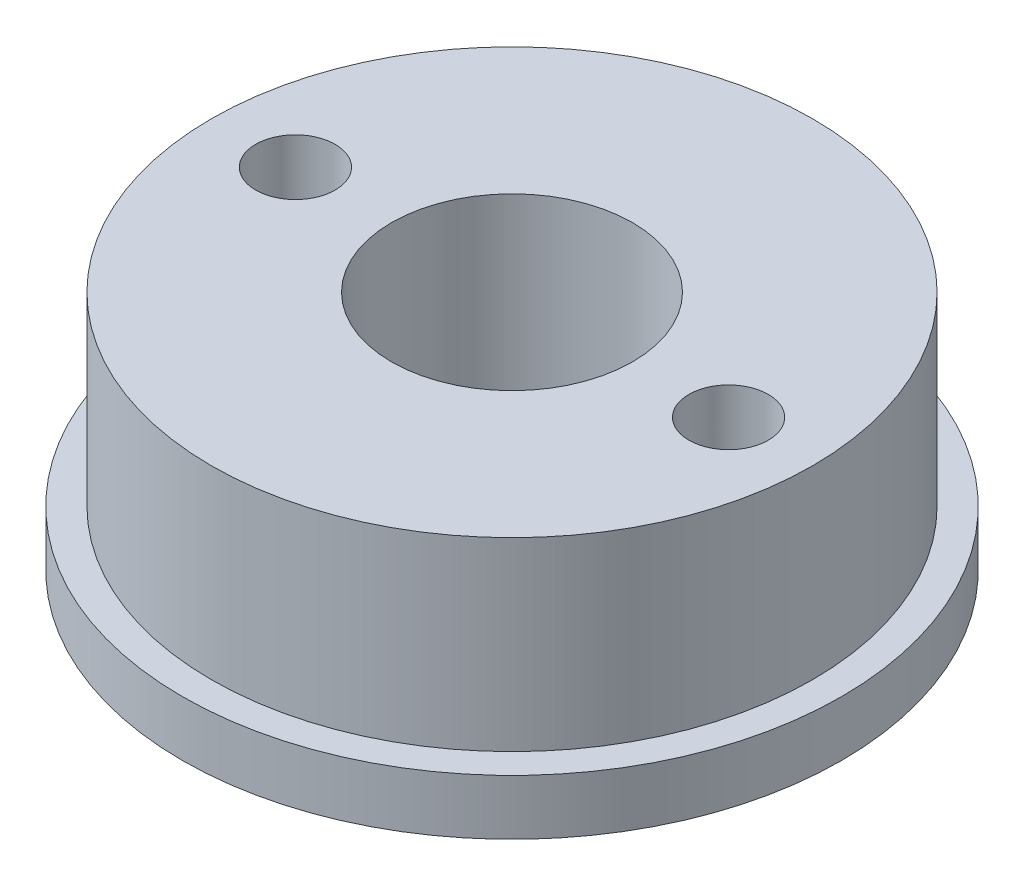
ISO-10303-21;
HEADER;
FILE_DESCRIPTION(('STEP AP214'),'2;1');
FILE_NAME('part.step','',(''),(''),'','','');
FILE_SCHEMA(('AUTOMOTIVE_DESIGN { 1 0 10303 214 1 1 1 1 }'));
ENDSEC;
DATA;
#1=APPLICATION_CONTEXT('core data for automotive mechanical design processes');
#2=APPLICATION_PROTOCOL_DEFINITION('international standard','automotive_design',2000,#1);
#3=PRODUCT_CONTEXT('',#1,'mechanical');
#4=PRODUCT('Part','Part','',(#3));
#5=PRODUCT_RELATED_PRODUCT_CATEGORY('part','',(#4));
#6=PRODUCT_DEFINITION_FORMATION('','',#4);
#7=PRODUCT_DEFINITION_CONTEXT('part definition',#1,'design');
#8=PRODUCT_DEFINITION('design','',#6,#7);
#9=PRODUCT_DEFINITION_SHAPE('','',#8);
#10=(LENGTH_UNIT() NAMED_UNIT(*) SI_UNIT(.MILLI.,.METRE.));
#11=(NAMED_UNIT(*) PLANE_ANGLE_UNIT() SI_UNIT($,.RADIAN.));
#12=(NAMED_UNIT(*) SI_UNIT($,.STERADIAN.) SOLID_ANGLE_UNIT());
#13=UNCERTAINTY_MEASURE_WITH_UNIT(LENGTH_MEASURE(1.E-05),#10,'distance_accuracy_value','');
#14=(GEOMETRIC_REPRESENTATION_CONTEXT(3) GLOBAL_UNCERTAINTY_ASSIGNED_CONTEXT((#13)) GLOBAL_UNIT_ASSIGNED_CONTEXT((#10,
#11,#12)) REPRESENTATION_CONTEXT('',''));
#15=CARTESIAN_POINT('',(0.,0.,0.));
#16=DIRECTION('',(0.,0.,1.));
#17=DIRECTION('',(1.,0.,0.));
#18=AXIS2_PLACEMENT_3D('',#15,#16,#17);
#19=CARTESIAN_POINT('',(0.,2.3,0.));
#20=DIRECTION('',(0.,-1.,0.));
#21=DIRECTION('',(0.,0.,-1.));
#22=AXIS2_PLACEMENT_3D('',#19,#20,#21);
#23=CYLINDRICAL_SURFACE('',#22,13.7);
#24=CARTESIAN_POINT('',(0.,2.3,0.));
#25=DIRECTION('',(0.,1.,0.));
#26=DIRECTION('',(0.,0.,1.));
#27=AXIS2_PLACEMENT_3D('',#24,#25,#26);
#28=CIRCLE('',#27,13.7);
#29=CARTESIAN_POINT('',(0.,2.3,13.7));
#30=VERTEX_POINT('',#29);
#31=EDGE_CURVE('E41',#30,#30,#28,.T.);
#32=ORIENTED_EDGE('',*,*,#31,.F.);
#33=EDGE_LOOP('',(#32));
#34=FACE_BOUND('',#33,.T.);
#35=CARTESIAN_POINT('',(0.,0.,0.));
#36=DIRECTION('',(0.,1.,0.));
#37=DIRECTION('',(0.,0.,1.));
#38=AXIS2_PLACEMENT_3D('',#35,#36,#37);
#39=CIRCLE('',#38,13.7);
#40=CARTESIAN_POINT('',(0.,0.,13.7));
#41=VERTEX_POINT('',#40);
#42=EDGE_CURVE('E37',#41,#41,#39,.T.);
#43=ORIENTED_EDGE('',*,*,#42,.T.);
#44=EDGE_LOOP('',(#43));
#45=FACE_BOUND('',#44,.T.);
#46=ADVANCED_FACE('F34',(#34,#45),#23,.T.);
#47=CARTESIAN_POINT('',(0.,2.3,0.));
#48=DIRECTION('',(0.,1.,0.));
#49=DIRECTION('',(0.,0.,1.));
#50=AXIS2_PLACEMENT_3D('',#47,#48,#49);
#51=PLANE('',#50);
#52=CARTESIAN_POINT('',(0.,2.3,0.));
#53=DIRECTION('',(0.,1.,0.));
#54=DIRECTION('',(0.,0.,1.));
#55=AXIS2_PLACEMENT_3D('',#52,#53,#54);
#56=CIRCLE('',#55,12.49);
#57=CARTESIAN_POINT('',(0.,2.3,12.49));
#58=VERTEX_POINT('',#57);
#59=EDGE_CURVE('E10',#58,#58,#56,.T.);
#60=ORIENTED_EDGE('',*,*,#59,.F.);
#61=EDGE_LOOP('',(#60));
#62=FACE_BOUND('',#61,.T.);
#63=ORIENTED_EDGE('',*,*,#31,.T.);
#64=EDGE_LOOP('',(#63));
#65=FACE_BOUND('',#64,.T.);
#66=ADVANCED_FACE('F76',(#62,#65),#51,.T.);
#67=CARTESIAN_POINT('',(0.,0.,0.));
#68=DIRECTION('',(0.,1.,0.));
#69=DIRECTION('',(0.,0.,1.));
#70=AXIS2_PLACEMENT_3D('',#67,#68,#69);
#71=PLANE('',#70);
#72=CARTESIAN_POINT('',(-9.,0.,0.));
#73=DIRECTION('',(0.,-1.,0.));
#74=DIRECTION('',(0.,0.,1.));
#75=AXIS2_PLACEMENT_3D('',#72,#73,#74);
#76=CIRCLE('',#75,1.65);
#77=CARTESIAN_POINT('',(-9.,0.,1.65));
#78=VERTEX_POINT('',#77);
#79=EDGE_CURVE('E61',#78,#78,#76,.T.);
#80=ORIENTED_EDGE('',*,*,#79,.F.);
#81=EDGE_LOOP('',(#80));
#82=FACE_BOUND('',#81,.T.);
#83=CARTESIAN_POINT('',(9.,0.,0.));
#84=DIRECTION('',(0.,-1.,0.));
#85=DIRECTION('',(0.,0.,-1.));
#86=AXIS2_PLACEMENT_3D('',#83,#84,#85);
#87=CIRCLE('',#86,1.65);
#88=CARTESIAN_POINT('',(9.,0.,-1.65));
#89=VERTEX_POINT('',#88);
#90=EDGE_CURVE('E60',#89,#89,#87,.T.);
#91=ORIENTED_EDGE('',*,*,#90,.F.);
#92=EDGE_LOOP('',(#91));
#93=FACE_BOUND('',#92,.T.);
#94=CARTESIAN_POINT('',(0.,0.,0.));
#95=DIRECTION('',(0.,-1.,0.));
#96=DIRECTION('',(0.,0.,-1.));
#97=AXIS2_PLACEMENT_3D('',#94,#95,#96);
#98=CIRCLE('',#97,5.01);
#99=CARTESIAN_POINT('',(0.,0.,-5.01));
#100=VERTEX_POINT('',#99);
#101=EDGE_CURVE('E53',#100,#100,#98,.T.);
#102=ORIENTED_EDGE('',*,*,#101,.F.);
#103=EDGE_LOOP('',(#102));
#104=FACE_BOUND('',#103,.T.);
#105=ORIENTED_EDGE('',*,*,#42,.F.);
#106=EDGE_LOOP('',(#105));
#107=FACE_BOUND('',#106,.T.);
#108=ADVANCED_FACE('F72',(#82,#93,#104,#107),#71,.F.);
#109=CARTESIAN_POINT('',(0.,10.,0.));
#110=DIRECTION('',(0.,-1.,0.));
#111=DIRECTION('',(0.,0.,-1.));
#112=AXIS2_PLACEMENT_3D('',#109,#110,#111);
#113=CYLINDRICAL_SURFACE('',#112,12.49);
#114=CARTESIAN_POINT('',(0.,10.,0.));
#115=DIRECTION('',(0.,1.,0.));
#116=DIRECTION('',(0.,0.,1.));
#117=AXIS2_PLACEMENT_3D('',#114,#115,#116);
#118=CIRCLE('',#117,12.49);
#119=CARTESIAN_POINT('',(0.,10.,12.49));
#120=VERTEX_POINT('',#119);
#121=EDGE_CURVE('E47',#120,#120,#118,.T.);
#122=ORIENTED_EDGE('',*,*,#121,.F.);
#123=EDGE_LOOP('',(#122));
#124=FACE_BOUND('',#123,.T.);
#125=ORIENTED_EDGE('',*,*,#59,.T.);
#126=EDGE_LOOP('',(#125));
#127=FACE_BOUND('',#126,.T.);
#128=ADVANCED_FACE('F75',(#124,#127),#113,.T.);
#129=CARTESIAN_POINT('',(0.,10.,0.));
#130=DIRECTION('',(0.,1.,0.));
#131=DIRECTION('',(0.,0.,1.));
#132=AXIS2_PLACEMENT_3D('',#129,#130,#131);
#133=PLANE('',#132);
#134=CARTESIAN_POINT('',(-9.,10.,0.));
#135=DIRECTION('',(0.,1.,0.));
#136=DIRECTION('',(0.,0.,1.));
#137=AXIS2_PLACEMENT_3D('',#134,#135,#136);
#138=CIRCLE('',#137,1.65);
#139=CARTESIAN_POINT('',(-9.,10.,1.65));
#140=VERTEX_POINT('',#139);
#141=EDGE_CURVE('E57',#140,#140,#138,.F.);
#142=ORIENTED_EDGE('',*,*,#141,.T.);
#143=EDGE_LOOP('',(#142));
#144=FACE_BOUND('',#143,.T.);
#145=CARTESIAN_POINT('',(9.,10.,0.));
#146=DIRECTION('',(0.,1.,0.));
#147=DIRECTION('',(0.,0.,1.));
#148=AXIS2_PLACEMENT_3D('',#145,#146,#147);
#149=CIRCLE('',#148,1.65);
#150=CARTESIAN_POINT('',(9.,10.,1.65));
#151=VERTEX_POINT('',#150);
#152=EDGE_CURVE('E56',#151,#151,#149,.F.);
#153=ORIENTED_EDGE('',*,*,#152,.T.);
#154=EDGE_LOOP('',(#153));
#155=FACE_BOUND('',#154,.T.);
#156=CARTESIAN_POINT('',(0.,10.,0.));
#157=DIRECTION('',(0.,1.,0.));
#158=DIRECTION('',(0.,0.,1.));
#159=AXIS2_PLACEMENT_3D('',#156,#157,#158);
#160=CIRCLE('',#159,5.01);
#161=CARTESIAN_POINT('',(0.,10.,5.01));
#162=VERTEX_POINT('',#161);
#163=EDGE_CURVE('E50',#162,#162,#160,.F.);
#164=ORIENTED_EDGE('',*,*,#163,.T.);
#165=EDGE_LOOP('',(#164));
#166=FACE_BOUND('',#165,.T.);
#167=ORIENTED_EDGE('',*,*,#121,.T.);
#168=EDGE_LOOP('',(#167));
#169=FACE_BOUND('',#168,.T.);
#170=ADVANCED_FACE('F97',(#144,#155,#166,#169),#133,.T.);
#171=CARTESIAN_POINT('',(0.,24.1704198949784,0.));
#172=DIRECTION('',(0.,-1.,0.));
#173=DIRECTION('',(0.,0.,-1.));
#174=AXIS2_PLACEMENT_3D('',#171,#172,#173);
#175=CYLINDRICAL_SURFACE('',#174,5.01);
#176=ORIENTED_EDGE('',*,*,#101,.T.);
#177=EDGE_LOOP('',(#176));
#178=FACE_BOUND('',#177,.T.);
#179=ORIENTED_EDGE('',*,*,#163,.F.);
#180=EDGE_LOOP('',(#179));
#181=FACE_BOUND('',#180,.T.);
#182=ADVANCED_FACE('F101',(#178,#181),#175,.F.);
#183=CARTESIAN_POINT('',(9.,24.1704198949784,0.));
#184=DIRECTION('',(0.,-1.,0.));
#185=DIRECTION('',(0.,0.,-1.));
#186=AXIS2_PLACEMENT_3D('',#183,#184,#185);
#187=CYLINDRICAL_SURFACE('',#186,1.65);
#188=ORIENTED_EDGE('',*,*,#90,.T.);
#189=EDGE_LOOP('',(#188));
#190=FACE_BOUND('',#189,.T.);
#191=ORIENTED_EDGE('',*,*,#152,.F.);
#192=EDGE_LOOP('',(#191));
#193=FACE_BOUND('',#192,.T.);
#194=ADVANCED_FACE('F69',(#190,#193),#187,.F.);
#195=CARTESIAN_POINT('',(-9.,24.1704198949784,0.));
#196=DIRECTION('',(0.,-1.,0.));
#197=DIRECTION('',(0.,0.,-1.));
#198=AXIS2_PLACEMENT_3D('',#195,#196,#197);
#199=CYLINDRICAL_SURFACE('',#198,1.65);
#200=ORIENTED_EDGE('',*,*,#79,.T.);
#201=EDGE_LOOP('',(#200));
#202=FACE_BOUND('',#201,.T.);
#203=ORIENTED_EDGE('',*,*,#141,.F.);
#204=EDGE_LOOP('',(#203));
#205=FACE_BOUND('',#204,.T.);
#206=ADVANCED_FACE('F106',(#202,#205),#199,.F.);
#207=CLOSED_SHELL('',(#46,#66,#108,#128,#170,#182,#194,#206));
#208=MANIFOLD_SOLID_BREP('B2',#207);
#209=ADVANCED_BREP_SHAPE_REPRESENTATION('',(#18,#208),#14);
#210=SHAPE_DEFINITION_REPRESENTATION(#9,#209);
ENDSEC;
END-ISO-10303-21;
